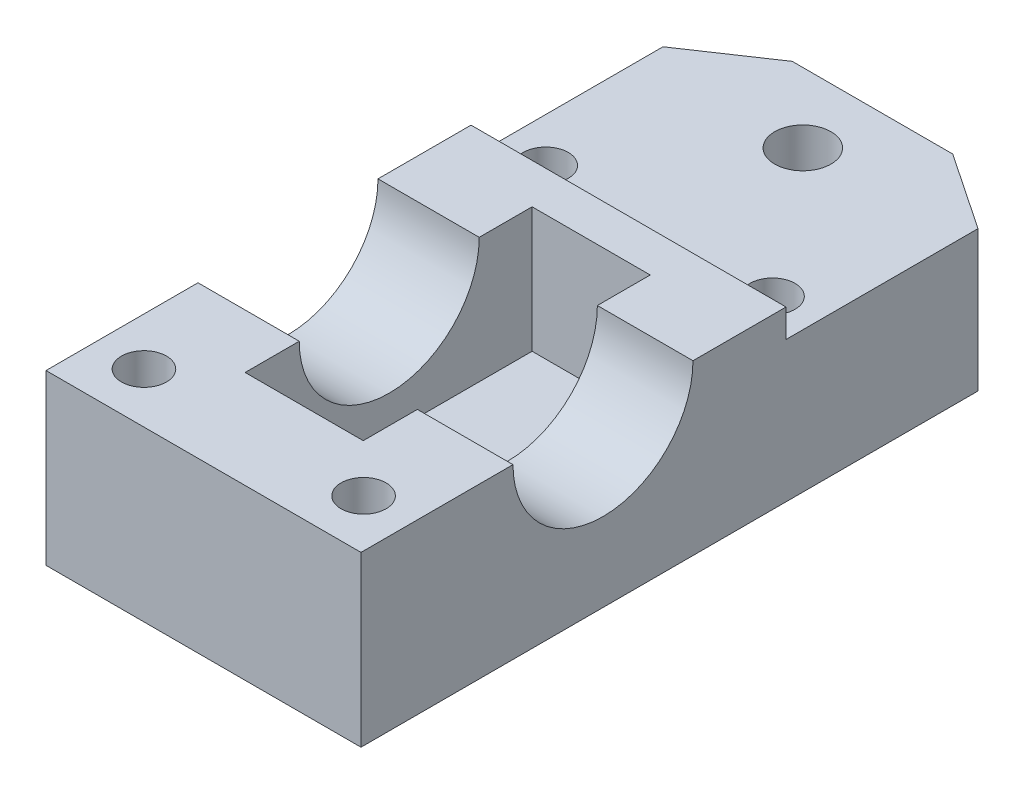
ISO-10303-21;
HEADER;
FILE_DESCRIPTION(('STEP AP214'),'2;1');
FILE_NAME('part.step','',(''),(''),'','','');
FILE_SCHEMA(('AUTOMOTIVE_DESIGN { 1 0 10303 214 1 1 1 1 }'));
ENDSEC;
DATA;
#1=APPLICATION_CONTEXT('core data for automotive mechanical design processes');
#2=APPLICATION_PROTOCOL_DEFINITION('international standard','automotive_design',2000,#1);
#3=PRODUCT_CONTEXT('',#1,'mechanical');
#4=PRODUCT('Part','Part','',(#3));
#5=PRODUCT_RELATED_PRODUCT_CATEGORY('part','',(#4));
#6=PRODUCT_DEFINITION_FORMATION('','',#4);
#7=PRODUCT_DEFINITION_CONTEXT('part definition',#1,'design');
#8=PRODUCT_DEFINITION('design','',#6,#7);
#9=PRODUCT_DEFINITION_SHAPE('','',#8);
#10=(LENGTH_UNIT() NAMED_UNIT(*) SI_UNIT(.MILLI.,.METRE.));
#11=(NAMED_UNIT(*) PLANE_ANGLE_UNIT() SI_UNIT($,.RADIAN.));
#12=(NAMED_UNIT(*) SI_UNIT($,.STERADIAN.) SOLID_ANGLE_UNIT());
#13=UNCERTAINTY_MEASURE_WITH_UNIT(LENGTH_MEASURE(1.E-05),#10,'distance_accuracy_value','');
#14=(GEOMETRIC_REPRESENTATION_CONTEXT(3) GLOBAL_UNCERTAINTY_ASSIGNED_CONTEXT((#13)) GLOBAL_UNIT_ASSIGNED_CONTEXT((#10,
#11,#12)) REPRESENTATION_CONTEXT('',''));
#15=CARTESIAN_POINT('',(0.,0.,0.));
#16=DIRECTION('',(0.,0.,1.));
#17=DIRECTION('',(1.,0.,0.));
#18=AXIS2_PLACEMENT_3D('',#15,#16,#17);
#19=CARTESIAN_POINT('',(14.,15.,27.8802988395114));
#20=DIRECTION('',(0.,1.,0.));
#21=DIRECTION('',(0.,0.,1.));
#22=AXIS2_PLACEMENT_3D('',#19,#20,#21);
#23=PLANE('',#22);
#24=CARTESIAN_POINT('',(9.76104748218694,15.,23.4115544975059));
#25=DIRECTION('',(0.,1.,0.));
#26=DIRECTION('',(0.,0.,-1.));
#27=AXIS2_PLACEMENT_3D('',#24,#25,#26);
#28=CIRCLE('',#27,2.);
#29=CARTESIAN_POINT('',(9.76104748218694,15.,21.4115544975059));
#30=VERTEX_POINT('',#29);
#31=EDGE_CURVE('E180',#30,#30,#28,.T.);
#32=ORIENTED_EDGE('',*,*,#31,.F.);
#33=EDGE_LOOP('',(#32));
#34=FACE_BOUND('',#33,.T.);
#35=CARTESIAN_POINT('',(-9.76104748218696,15.,23.4115544975059));
#36=DIRECTION('',(0.,1.,0.));
#37=DIRECTION('',(0.,0.,1.));
#38=AXIS2_PLACEMENT_3D('',#35,#36,#37);
#39=CIRCLE('',#38,2.);
#40=CARTESIAN_POINT('',(-9.76104748218696,15.,25.4115544975059));
#41=VERTEX_POINT('',#40);
#42=EDGE_CURVE('E184',#41,#41,#39,.T.);
#43=ORIENTED_EDGE('',*,*,#42,.F.);
#44=EDGE_LOOP('',(#43));
#45=FACE_BOUND('',#44,.T.);
#46=DIRECTION('',(1.,0.,0.));
#47=VECTOR('',#46,1.);
#48=CARTESIAN_POINT('',(-14.,15.,14.370296179535));
#49=LINE('',#48,#47);
#50=CARTESIAN_POINT('',(-14.,15.,14.370296179535));
#51=VERTEX_POINT('',#50);
#52=CARTESIAN_POINT('',(-5.,15.,14.370296179535));
#53=VERTEX_POINT('',#52);
#54=EDGE_CURVE('E56',#51,#53,#49,.T.);
#55=ORIENTED_EDGE('',*,*,#54,.F.);
#56=DIRECTION('',(0.,0.,1.));
#57=VECTOR('',#56,1.);
#58=CARTESIAN_POINT('',(-14.,15.,-26.9642041662331));
#59=LINE('',#58,#57);
#60=CARTESIAN_POINT('',(-14.,15.,27.8802988395114));
#61=VERTEX_POINT('',#60);
#62=EDGE_CURVE('E247',#51,#61,#59,.T.);
#63=ORIENTED_EDGE('',*,*,#62,.T.);
#64=DIRECTION('',(1.,0.,0.));
#65=VECTOR('',#64,1.);
#66=CARTESIAN_POINT('',(-14.,15.,27.8802988395114));
#67=LINE('',#66,#65);
#68=CARTESIAN_POINT('',(14.,15.,27.8802988395114));
#69=VERTEX_POINT('',#68);
#70=EDGE_CURVE('E251',#61,#69,#67,.T.);
#71=ORIENTED_EDGE('',*,*,#70,.T.);
#72=DIRECTION('',(0.,0.,-1.));
#73=VECTOR('',#72,1.);
#74=CARTESIAN_POINT('',(14.,15.,-26.9642041662331));
#75=LINE('',#74,#73);
#76=CARTESIAN_POINT('',(14.,15.,14.370296179535));
#77=VERTEX_POINT('',#76);
#78=EDGE_CURVE('E244',#69,#77,#75,.T.);
#79=ORIENTED_EDGE('',*,*,#78,.T.);
#80=CARTESIAN_POINT('',(5.5,15.,14.370296179535));
#81=VERTEX_POINT('',#80);
#82=EDGE_CURVE('E199',#81,#77,#49,.T.);
#83=ORIENTED_EDGE('',*,*,#82,.F.);
#84=DIRECTION('',(0.,0.,1.));
#85=VECTOR('',#84,1.);
#86=CARTESIAN_POINT('',(5.5,15.,-6.32837239447517));
#87=LINE('',#86,#85);
#88=CARTESIAN_POINT('',(5.5,15.,19.1819459682045));
#89=VERTEX_POINT('',#88);
#90=EDGE_CURVE('E222',#81,#89,#87,.T.);
#91=ORIENTED_EDGE('',*,*,#90,.T.);
#92=DIRECTION('',(1.,0.,0.));
#93=VECTOR('',#92,1.);
#94=CARTESIAN_POINT('',(-5.,15.,19.1819459682045));
#95=LINE('',#94,#93);
#96=CARTESIAN_POINT('',(-5.,15.,19.1819459682045));
#97=VERTEX_POINT('',#96);
#98=EDGE_CURVE('E217',#97,#89,#95,.T.);
#99=ORIENTED_EDGE('',*,*,#98,.F.);
#100=DIRECTION('',(0.,0.,1.));
#101=VECTOR('',#100,1.);
#102=CARTESIAN_POINT('',(-5.,15.,-6.32837239447517));
#103=LINE('',#102,#101);
#104=EDGE_CURVE('E208',#53,#97,#103,.T.);
#105=ORIENTED_EDGE('',*,*,#104,.F.);
#106=EDGE_LOOP('',(#55,#63,#71,#79,#83,#91,#99,#105));
#107=FACE_BOUND('',#106,.T.);
#108=ADVANCED_FACE('F32',(#34,#45,#107),#23,.T.);
#109=DIRECTION('',(1.,0.,0.));
#110=VECTOR('',#109,1.);
#111=CARTESIAN_POINT('',(14.,15.,-9.8999192844025));
#112=LINE('',#111,#110);
#113=CARTESIAN_POINT('',(-14.,15.,-9.89991928440249));
#114=VERTEX_POINT('',#113);
#115=CARTESIAN_POINT('',(14.,15.,-9.8999192844025));
#116=VERTEX_POINT('',#115);
#117=EDGE_CURVE('E159',#114,#116,#112,.T.);
#118=ORIENTED_EDGE('',*,*,#117,.F.);
#119=CARTESIAN_POINT('',(-14.,15.,-1.629703820465));
#120=VERTEX_POINT('',#119);
#121=EDGE_CURVE('E249',#114,#120,#59,.T.);
#122=ORIENTED_EDGE('',*,*,#121,.T.);
#123=DIRECTION('',(1.,0.,0.));
#124=VECTOR('',#123,1.);
#125=CARTESIAN_POINT('',(-14.,15.,-1.629703820465));
#126=LINE('',#125,#124);
#127=CARTESIAN_POINT('',(-5.,15.,-1.629703820465));
#128=VERTEX_POINT('',#127);
#129=EDGE_CURVE('E200',#128,#120,#126,.F.);
#130=ORIENTED_EDGE('',*,*,#129,.F.);
#131=CARTESIAN_POINT('',(-5.,15.,-6.32837239447517));
#132=VERTEX_POINT('',#131);
#133=EDGE_CURVE('E204',#132,#128,#103,.T.);
#134=ORIENTED_EDGE('',*,*,#133,.F.);
#135=DIRECTION('',(1.,0.,0.));
#136=VECTOR('',#135,1.);
#137=CARTESIAN_POINT('',(-5.,15.,-6.32837239447517));
#138=LINE('',#137,#136);
#139=CARTESIAN_POINT('',(5.5,15.,-6.32837239447517));
#140=VERTEX_POINT('',#139);
#141=EDGE_CURVE('E231',#132,#140,#138,.T.);
#142=ORIENTED_EDGE('',*,*,#141,.T.);
#143=CARTESIAN_POINT('',(5.5,15.,-1.629703820465));
#144=VERTEX_POINT('',#143);
#145=EDGE_CURVE('E218',#140,#144,#87,.T.);
#146=ORIENTED_EDGE('',*,*,#145,.T.);
#147=CARTESIAN_POINT('',(14.,15.,-1.629703820465));
#148=VERTEX_POINT('',#147);
#149=EDGE_CURVE('E196',#148,#144,#126,.F.);
#150=ORIENTED_EDGE('',*,*,#149,.F.);
#151=EDGE_CURVE('E248',#148,#116,#75,.T.);
#152=ORIENTED_EDGE('',*,*,#151,.T.);
#153=EDGE_LOOP('',(#118,#122,#130,#134,#142,#146,#150,#152));
#154=FACE_BOUND('',#153,.T.);
#155=ADVANCED_FACE('F317',(#154),#23,.T.);
#156=CARTESIAN_POINT('',(14.,0.,27.8802988395114));
#157=DIRECTION('',(0.,1.,0.));
#158=DIRECTION('',(0.,0.,1.));
#159=AXIS2_PLACEMENT_3D('',#156,#157,#158);
#160=PLANE('',#159);
#161=CARTESIAN_POINT('',(10.0800389171649,0.,-12.6210657860775));
#162=DIRECTION('',(0.,1.,0.));
#163=DIRECTION('',(0.,0.,-1.));
#164=AXIS2_PLACEMENT_3D('',#161,#162,#163);
#165=CIRCLE('',#164,2.);
#166=CARTESIAN_POINT('',(10.0800389171649,0.,-10.6210657860775));
#167=VERTEX_POINT('',#166);
#168=EDGE_CURVE('E522',#167,#167,#165,.T.);
#169=ORIENTED_EDGE('',*,*,#168,.T.);
#170=EDGE_LOOP('',(#169));
#171=FACE_BOUND('',#170,.T.);
#172=CARTESIAN_POINT('',(-10.0800389171649,0.,-12.6210657860775));
#173=DIRECTION('',(0.,1.,0.));
#174=DIRECTION('',(0.,0.,1.));
#175=AXIS2_PLACEMENT_3D('',#172,#173,#174);
#176=CIRCLE('',#175,2.);
#177=CARTESIAN_POINT('',(-10.0800389171649,0.,-10.6210657860775));
#178=VERTEX_POINT('',#177);
#179=EDGE_CURVE('E173',#178,#178,#176,.T.);
#180=ORIENTED_EDGE('',*,*,#179,.T.);
#181=EDGE_LOOP('',(#180));
#182=FACE_BOUND('',#181,.T.);
#183=CARTESIAN_POINT('',(9.76104748218694,0.,23.4115544975059));
#184=DIRECTION('',(0.,1.,0.));
#185=DIRECTION('',(0.,0.,-1.));
#186=AXIS2_PLACEMENT_3D('',#183,#184,#185);
#187=CIRCLE('',#186,2.);
#188=CARTESIAN_POINT('',(9.76104748218694,0.,21.4115544975059));
#189=VERTEX_POINT('',#188);
#190=EDGE_CURVE('E181',#189,#189,#187,.T.);
#191=ORIENTED_EDGE('',*,*,#190,.T.);
#192=EDGE_LOOP('',(#191));
#193=FACE_BOUND('',#192,.T.);
#194=CARTESIAN_POINT('',(-9.76104748218696,0.,23.4115544975059));
#195=DIRECTION('',(0.,1.,0.));
#196=DIRECTION('',(0.,0.,1.));
#197=AXIS2_PLACEMENT_3D('',#194,#195,#196);
#198=CIRCLE('',#197,2.);
#199=CARTESIAN_POINT('',(-9.76104748218696,0.,25.4115544975059));
#200=VERTEX_POINT('',#199);
#201=EDGE_CURVE('E187',#200,#200,#198,.T.);
#202=ORIENTED_EDGE('',*,*,#201,.T.);
#203=EDGE_LOOP('',(#202));
#204=FACE_BOUND('',#203,.T.);
#205=DIRECTION('',(0.,0.,-1.));
#206=VECTOR('',#205,1.);
#207=CARTESIAN_POINT('',(14.,0.,-26.9642041662331));
#208=LINE('',#207,#206);
#209=CARTESIAN_POINT('',(14.,0.,27.8802988395114));
#210=VERTEX_POINT('',#209);
#211=CARTESIAN_POINT('',(14.,0.,-26.9642041662331));
#212=VERTEX_POINT('',#211);
#213=EDGE_CURVE('E243',#210,#212,#208,.T.);
#214=ORIENTED_EDGE('',*,*,#213,.F.);
#215=DIRECTION('',(1.,0.,0.));
#216=VECTOR('',#215,1.);
#217=CARTESIAN_POINT('',(-14.,0.,27.8802988395114));
#218=LINE('',#217,#216);
#219=CARTESIAN_POINT('',(-14.,0.,27.8802988395114));
#220=VERTEX_POINT('',#219);
#221=EDGE_CURVE('E266',#220,#210,#218,.T.);
#222=ORIENTED_EDGE('',*,*,#221,.F.);
#223=DIRECTION('',(0.,0.,1.));
#224=VECTOR('',#223,1.);
#225=CARTESIAN_POINT('',(-14.,0.,-26.9642041662331));
#226=LINE('',#225,#224);
#227=CARTESIAN_POINT('',(-14.,0.,-26.9642041662331));
#228=VERTEX_POINT('',#227);
#229=EDGE_CURVE('E264',#228,#220,#226,.T.);
#230=ORIENTED_EDGE('',*,*,#229,.F.);
#231=DIRECTION('',(-0.82965477811203,0.,0.558276767522953));
#232=VECTOR('',#231,1.);
#233=CARTESIAN_POINT('',(-14.,0.,-26.9642041662331));
#234=LINE('',#233,#232);
#235=CARTESIAN_POINT('',(-7.13172713902183,0.,-31.5858820887277));
#236=VERTEX_POINT('',#235);
#237=EDGE_CURVE('E261',#236,#228,#234,.T.);
#238=ORIENTED_EDGE('',*,*,#237,.F.);
#239=DIRECTION('',(-1.,0.,0.));
#240=VECTOR('',#239,1.);
#241=CARTESIAN_POINT('',(-7.13172713902183,0.,-31.5858820887277));
#242=LINE('',#241,#240);
#243=CARTESIAN_POINT('',(7.13172713902183,0.,-31.5858820887277));
#244=VERTEX_POINT('',#243);
#245=EDGE_CURVE('E258',#244,#236,#242,.T.);
#246=ORIENTED_EDGE('',*,*,#245,.F.);
#247=DIRECTION('',(-0.82965477811203,0.,-0.558276767522953));
#248=VECTOR('',#247,1.);
#249=CARTESIAN_POINT('',(14.,0.,-26.9642041662331));
#250=LINE('',#249,#248);
#251=EDGE_CURVE('E255',#212,#244,#250,.T.);
#252=ORIENTED_EDGE('',*,*,#251,.F.);
#253=EDGE_LOOP('',(#214,#222,#230,#238,#246,#252));
#254=FACE_BOUND('',#253,.T.);
#255=CARTESIAN_POINT('',(0.,0.,-25.393583101561));
#256=DIRECTION('',(0.,1.,0.));
#257=DIRECTION('',(0.,0.,1.));
#258=AXIS2_PLACEMENT_3D('',#255,#256,#257);
#259=CIRCLE('',#258,2.5);
#260=CARTESIAN_POINT('',(0.,0.,-22.893583101561));
#261=VERTEX_POINT('',#260);
#262=EDGE_CURVE('E234',#261,#261,#259,.T.);
#263=ORIENTED_EDGE('',*,*,#262,.T.);
#264=EDGE_LOOP('',(#263));
#265=FACE_BOUND('',#264,.T.);
#266=ADVANCED_FACE('F286',(#171,#182,#193,#204,#254,#265),#160,.F.);
#267=CARTESIAN_POINT('',(14.,15.,-26.9642041662331));
#268=DIRECTION('',(-1.,0.,0.));
#269=DIRECTION('',(0.,0.,1.));
#270=AXIS2_PLACEMENT_3D('',#267,#268,#269);
#271=PLANE('',#270);
#272=DIRECTION('',(0.,0.,1.));
#273=VECTOR('',#272,1.);
#274=CARTESIAN_POINT('',(14.,12.5,-31.5858820887277));
#275=LINE('',#274,#273);
#276=CARTESIAN_POINT('',(14.,12.5,-26.9642041662331));
#277=VERTEX_POINT('',#276);
#278=CARTESIAN_POINT('',(14.,12.5,-9.8999192844025));
#279=VERTEX_POINT('',#278);
#280=EDGE_CURVE('E148',#277,#279,#275,.T.);
#281=ORIENTED_EDGE('',*,*,#280,.T.);
#282=DIRECTION('',(0.,1.,0.));
#283=VECTOR('',#282,1.);
#284=CARTESIAN_POINT('',(14.,18.9663543482973,-9.8999192844025));
#285=LINE('',#284,#283);
#286=EDGE_CURVE('E156',#279,#116,#285,.T.);
#287=ORIENTED_EDGE('',*,*,#286,.T.);
#288=ORIENTED_EDGE('',*,*,#151,.F.);
#289=CARTESIAN_POINT('',(14.,15.,6.370296179535));
#290=DIRECTION('',(1.,0.,0.));
#291=DIRECTION('',(0.,0.,-1.));
#292=AXIS2_PLACEMENT_3D('',#289,#290,#291);
#293=CIRCLE('',#292,8.);
#294=EDGE_CURVE('E190',#77,#148,#293,.T.);
#295=ORIENTED_EDGE('',*,*,#294,.F.);
#296=ORIENTED_EDGE('',*,*,#78,.F.);
#297=DIRECTION('',(0.,-1.,0.));
#298=VECTOR('',#297,1.);
#299=CARTESIAN_POINT('',(14.,15.,27.8802988395114));
#300=LINE('',#299,#298);
#301=EDGE_CURVE('E253',#69,#210,#300,.T.);
#302=ORIENTED_EDGE('',*,*,#301,.T.);
#303=ORIENTED_EDGE('',*,*,#213,.T.);
#304=DIRECTION('',(0.,-1.,0.));
#305=VECTOR('',#304,1.);
#306=CARTESIAN_POINT('',(14.,15.,-26.9642041662331));
#307=LINE('',#306,#305);
#308=EDGE_CURVE('E41',#277,#212,#307,.T.);
#309=ORIENTED_EDGE('',*,*,#308,.F.);
#310=EDGE_LOOP('',(#281,#287,#288,#295,#296,#302,#303,#309));
#311=FACE_BOUND('',#310,.T.);
#312=ADVANCED_FACE('F34',(#311),#271,.F.);
#313=CARTESIAN_POINT('',(14.,15.,-26.9642041662331));
#314=DIRECTION('',(-0.558276767522953,0.,0.82965477811203));
#315=DIRECTION('',(0.829654778112031,0.,0.558276767522953));
#316=AXIS2_PLACEMENT_3D('',#313,#314,#315);
#317=PLANE('',#316);
#318=DIRECTION('',(0.,-1.,0.));
#319=VECTOR('',#318,1.);
#320=CARTESIAN_POINT('',(7.13172713902183,15.,-31.5858820887277));
#321=LINE('',#320,#319);
#322=CARTESIAN_POINT('',(7.13172713902183,12.5,-31.5858820887277));
#323=VERTEX_POINT('',#322);
#324=EDGE_CURVE('E277',#323,#244,#321,.T.);
#325=ORIENTED_EDGE('',*,*,#324,.F.);
#326=DIRECTION('',(0.829654778112031,0.,0.558276767522953));
#327=VECTOR('',#326,1.);
#328=CARTESIAN_POINT('',(14.,12.5,-26.9642041662331));
#329=LINE('',#328,#327);
#330=EDGE_CURVE('E177',#323,#277,#329,.T.);
#331=ORIENTED_EDGE('',*,*,#330,.T.);
#332=ORIENTED_EDGE('',*,*,#308,.T.);
#333=ORIENTED_EDGE('',*,*,#251,.T.);
#334=EDGE_LOOP('',(#325,#331,#332,#333));
#335=FACE_BOUND('',#334,.T.);
#336=ADVANCED_FACE('F282',(#335),#317,.F.);
#337=CARTESIAN_POINT('',(-7.13172713902183,15.,-31.5858820887277));
#338=DIRECTION('',(0.,0.,1.));
#339=DIRECTION('',(1.,0.,0.));
#340=AXIS2_PLACEMENT_3D('',#337,#338,#339);
#341=PLANE('',#340);
#342=DIRECTION('',(0.,-1.,0.));
#343=VECTOR('',#342,1.);
#344=CARTESIAN_POINT('',(-7.13172713902183,15.,-31.5858820887277));
#345=LINE('',#344,#343);
#346=CARTESIAN_POINT('',(-7.13172713902182,12.5,-31.5858820887277));
#347=VERTEX_POINT('',#346);
#348=EDGE_CURVE('E275',#347,#236,#345,.T.);
#349=ORIENTED_EDGE('',*,*,#348,.F.);
#350=DIRECTION('',(-1.,0.,0.));
#351=VECTOR('',#350,1.);
#352=CARTESIAN_POINT('',(14.,12.5,-31.5858820887277));
#353=LINE('',#352,#351);
#354=EDGE_CURVE('E153',#323,#347,#353,.T.);
#355=ORIENTED_EDGE('',*,*,#354,.F.);
#356=ORIENTED_EDGE('',*,*,#324,.T.);
#357=ORIENTED_EDGE('',*,*,#245,.T.);
#358=EDGE_LOOP('',(#349,#355,#356,#357));
#359=FACE_BOUND('',#358,.T.);
#360=ADVANCED_FACE('F308',(#359),#341,.F.);
#361=CARTESIAN_POINT('',(-14.,15.,-26.9642041662331));
#362=DIRECTION('',(0.558276767522953,0.,0.82965477811203));
#363=DIRECTION('',(0.829654778112031,0.,-0.558276767522953));
#364=AXIS2_PLACEMENT_3D('',#361,#362,#363);
#365=PLANE('',#364);
#366=DIRECTION('',(0.,-1.,0.));
#367=VECTOR('',#366,1.);
#368=CARTESIAN_POINT('',(-14.,15.,-26.9642041662331));
#369=LINE('',#368,#367);
#370=CARTESIAN_POINT('',(-14.,12.5,-26.9642041662331));
#371=VERTEX_POINT('',#370);
#372=EDGE_CURVE('E273',#371,#228,#369,.T.);
#373=ORIENTED_EDGE('',*,*,#372,.F.);
#374=DIRECTION('',(0.829654778112031,0.,-0.558276767522953));
#375=VECTOR('',#374,1.);
#376=CARTESIAN_POINT('',(-14.,12.5,-26.9642041662331));
#377=LINE('',#376,#375);
#378=EDGE_CURVE('E48',#371,#347,#377,.T.);
#379=ORIENTED_EDGE('',*,*,#378,.T.);
#380=ORIENTED_EDGE('',*,*,#348,.T.);
#381=ORIENTED_EDGE('',*,*,#237,.T.);
#382=EDGE_LOOP('',(#373,#379,#380,#381));
#383=FACE_BOUND('',#382,.T.);
#384=ADVANCED_FACE('F304',(#383),#365,.F.);
#385=CARTESIAN_POINT('',(-14.,15.,-26.9642041662331));
#386=DIRECTION('',(1.,0.,0.));
#387=DIRECTION('',(0.,0.,-1.));
#388=AXIS2_PLACEMENT_3D('',#385,#386,#387);
#389=PLANE('',#388);
#390=ORIENTED_EDGE('',*,*,#121,.F.);
#391=DIRECTION('',(0.,1.,0.));
#392=VECTOR('',#391,1.);
#393=CARTESIAN_POINT('',(-14.,18.9663543482973,-9.89991928440249));
#394=LINE('',#393,#392);
#395=CARTESIAN_POINT('',(-14.,12.5,-9.89991928440249));
#396=VERTEX_POINT('',#395);
#397=EDGE_CURVE('E166',#396,#114,#394,.T.);
#398=ORIENTED_EDGE('',*,*,#397,.F.);
#399=DIRECTION('',(0.,0.,1.));
#400=VECTOR('',#399,1.);
#401=CARTESIAN_POINT('',(-14.,12.5,-31.5858820887277));
#402=LINE('',#401,#400);
#403=EDGE_CURVE('E150',#371,#396,#402,.T.);
#404=ORIENTED_EDGE('',*,*,#403,.F.);
#405=ORIENTED_EDGE('',*,*,#372,.T.);
#406=ORIENTED_EDGE('',*,*,#229,.T.);
#407=DIRECTION('',(0.,-1.,0.));
#408=VECTOR('',#407,1.);
#409=CARTESIAN_POINT('',(-14.,15.,27.8802988395114));
#410=LINE('',#409,#408);
#411=EDGE_CURVE('E270',#61,#220,#410,.T.);
#412=ORIENTED_EDGE('',*,*,#411,.F.);
#413=ORIENTED_EDGE('',*,*,#62,.F.);
#414=CARTESIAN_POINT('',(-14.,15.,6.37029617953501));
#415=DIRECTION('',(1.,0.,0.));
#416=DIRECTION('',(0.,0.,-1.));
#417=AXIS2_PLACEMENT_3D('',#414,#415,#416);
#418=CIRCLE('',#417,8.);
#419=EDGE_CURVE('E193',#51,#120,#418,.T.);
#420=ORIENTED_EDGE('',*,*,#419,.T.);
#421=EDGE_LOOP('',(#390,#398,#404,#405,#406,#412,#413,#420));
#422=FACE_BOUND('',#421,.T.);
#423=ADVANCED_FACE('F300',(#422),#389,.F.);
#424=CARTESIAN_POINT('',(-14.,15.,27.8802988395114));
#425=DIRECTION('',(0.,0.,-1.));
#426=DIRECTION('',(-1.,0.,0.));
#427=AXIS2_PLACEMENT_3D('',#424,#425,#426);
#428=PLANE('',#427);
#429=ORIENTED_EDGE('',*,*,#221,.T.);
#430=ORIENTED_EDGE('',*,*,#301,.F.);
#431=ORIENTED_EDGE('',*,*,#70,.F.);
#432=ORIENTED_EDGE('',*,*,#411,.T.);
#433=EDGE_LOOP('',(#429,#430,#431,#432));
#434=FACE_BOUND('',#433,.T.);
#435=ADVANCED_FACE('F295',(#434),#428,.F.);
#436=CARTESIAN_POINT('',(0.,15.,-25.393583101561));
#437=DIRECTION('',(0.,-1.,0.));
#438=DIRECTION('',(0.,0.,-1.));
#439=AXIS2_PLACEMENT_3D('',#436,#437,#438);
#440=CYLINDRICAL_SURFACE('',#439,2.5);
#441=CARTESIAN_POINT('',(0.,12.5,-25.393583101561));
#442=DIRECTION('',(0.,-1.,0.));
#443=DIRECTION('',(0.,0.,-1.));
#444=AXIS2_PLACEMENT_3D('',#441,#442,#443);
#445=CIRCLE('',#444,2.5);
#446=CARTESIAN_POINT('',(0.,12.5,-27.893583101561));
#447=VERTEX_POINT('',#446);
#448=EDGE_CURVE('E36',#447,#447,#445,.T.);
#449=ORIENTED_EDGE('',*,*,#448,.F.);
#450=EDGE_LOOP('',(#449));
#451=FACE_BOUND('',#450,.T.);
#452=ORIENTED_EDGE('',*,*,#262,.F.);
#453=EDGE_LOOP('',(#452));
#454=FACE_BOUND('',#453,.T.);
#455=ADVANCED_FACE('F328',(#451,#454),#440,.F.);
#456=CARTESIAN_POINT('',(-5.,3.87685184192654,-6.32837239447517));
#457=DIRECTION('',(0.,0.,-1.));
#458=DIRECTION('',(0.,1.,0.));
#459=AXIS2_PLACEMENT_3D('',#456,#457,#458);
#460=PLANE('',#459);
#461=DIRECTION('',(0.,1.,0.));
#462=VECTOR('',#461,1.);
#463=CARTESIAN_POINT('',(5.5,3.87685184192654,-6.32837239447517));
#464=LINE('',#463,#462);
#465=CARTESIAN_POINT('',(5.5,3.87685184192654,-6.32837239447517));
#466=VERTEX_POINT('',#465);
#467=EDGE_CURVE('E228',#466,#140,#464,.T.);
#468=ORIENTED_EDGE('',*,*,#467,.T.);
#469=ORIENTED_EDGE('',*,*,#141,.F.);
#470=DIRECTION('',(0.,1.,0.));
#471=VECTOR('',#470,1.);
#472=CARTESIAN_POINT('',(-5.,3.87685184192654,-6.32837239447517));
#473=LINE('',#472,#471);
#474=CARTESIAN_POINT('',(-5.,3.87685184192654,-6.32837239447517));
#475=VERTEX_POINT('',#474);
#476=EDGE_CURVE('E214',#475,#132,#473,.T.);
#477=ORIENTED_EDGE('',*,*,#476,.F.);
#478=DIRECTION('',(1.,0.,0.));
#479=VECTOR('',#478,1.);
#480=CARTESIAN_POINT('',(-5.,3.87685184192654,-6.32837239447517));
#481=LINE('',#480,#479);
#482=EDGE_CURVE('E235',#475,#466,#481,.T.);
#483=ORIENTED_EDGE('',*,*,#482,.T.);
#484=EDGE_LOOP('',(#468,#469,#477,#483));
#485=FACE_BOUND('',#484,.T.);
#486=ADVANCED_FACE('F351',(#485),#460,.F.);
#487=CARTESIAN_POINT('',(-5.,3.87685184192654,19.1819459682045));
#488=DIRECTION('',(0.,-1.,0.));
#489=DIRECTION('',(0.,0.,-1.));
#490=AXIS2_PLACEMENT_3D('',#487,#488,#489);
#491=PLANE('',#490);
#492=DIRECTION('',(0.,0.,-1.));
#493=VECTOR('',#492,1.);
#494=CARTESIAN_POINT('',(5.5,3.87685184192654,19.1819459682045));
#495=LINE('',#494,#493);
#496=CARTESIAN_POINT('',(5.5,3.87685184192654,19.1819459682045));
#497=VERTEX_POINT('',#496);
#498=EDGE_CURVE('E225',#497,#466,#495,.T.);
#499=ORIENTED_EDGE('',*,*,#498,.T.);
#500=ORIENTED_EDGE('',*,*,#482,.F.);
#501=DIRECTION('',(0.,0.,-1.));
#502=VECTOR('',#501,1.);
#503=CARTESIAN_POINT('',(-5.,3.87685184192654,19.1819459682045));
#504=LINE('',#503,#502);
#505=CARTESIAN_POINT('',(-5.,3.87685184192654,19.1819459682045));
#506=VERTEX_POINT('',#505);
#507=EDGE_CURVE('E211',#506,#475,#504,.T.);
#508=ORIENTED_EDGE('',*,*,#507,.F.);
#509=DIRECTION('',(1.,0.,0.));
#510=VECTOR('',#509,1.);
#511=CARTESIAN_POINT('',(-5.,3.87685184192654,19.1819459682045));
#512=LINE('',#511,#510);
#513=EDGE_CURVE('E237',#506,#497,#512,.T.);
#514=ORIENTED_EDGE('',*,*,#513,.T.);
#515=EDGE_LOOP('',(#499,#500,#508,#514));
#516=FACE_BOUND('',#515,.T.);
#517=ADVANCED_FACE('F358',(#516),#491,.F.);
#518=CARTESIAN_POINT('',(-5.,15.,19.1819459682045));
#519=DIRECTION('',(0.,0.,1.));
#520=DIRECTION('',(0.,-1.,0.));
#521=AXIS2_PLACEMENT_3D('',#518,#519,#520);
#522=PLANE('',#521);
#523=DIRECTION('',(0.,-1.,0.));
#524=VECTOR('',#523,1.);
#525=CARTESIAN_POINT('',(5.5,15.,19.1819459682045));
#526=LINE('',#525,#524);
#527=EDGE_CURVE('E221',#89,#497,#526,.T.);
#528=ORIENTED_EDGE('',*,*,#527,.T.);
#529=ORIENTED_EDGE('',*,*,#513,.F.);
#530=DIRECTION('',(0.,-1.,0.));
#531=VECTOR('',#530,1.);
#532=CARTESIAN_POINT('',(-5.,15.,19.1819459682045));
#533=LINE('',#532,#531);
#534=EDGE_CURVE('E207',#97,#506,#533,.T.);
#535=ORIENTED_EDGE('',*,*,#534,.F.);
#536=ORIENTED_EDGE('',*,*,#98,.T.);
#537=EDGE_LOOP('',(#528,#529,#535,#536));
#538=FACE_BOUND('',#537,.T.);
#539=ADVANCED_FACE('F366',(#538),#522,.F.);
#540=CARTESIAN_POINT('',(-5.,15.,19.1819459682045));
#541=DIRECTION('',(1.,0.,0.));
#542=DIRECTION('',(0.,0.,-1.));
#543=AXIS2_PLACEMENT_3D('',#540,#541,#542);
#544=PLANE('',#543);
#545=CARTESIAN_POINT('',(-5.,15.,6.370296179535));
#546=DIRECTION('',(1.,0.,0.));
#547=DIRECTION('',(0.,0.,-1.));
#548=AXIS2_PLACEMENT_3D('',#545,#546,#547);
#549=CIRCLE('',#548,8.);
#550=EDGE_CURVE('E202',#53,#128,#549,.T.);
#551=ORIENTED_EDGE('',*,*,#550,.F.);
#552=ORIENTED_EDGE('',*,*,#104,.T.);
#553=ORIENTED_EDGE('',*,*,#534,.T.);
#554=ORIENTED_EDGE('',*,*,#507,.T.);
#555=ORIENTED_EDGE('',*,*,#476,.T.);
#556=ORIENTED_EDGE('',*,*,#133,.T.);
#557=EDGE_LOOP('',(#551,#552,#553,#554,#555,#556));
#558=FACE_BOUND('',#557,.T.);
#559=ADVANCED_FACE('F374',(#558),#544,.T.);
#560=CARTESIAN_POINT('',(5.5,15.,19.1819459682045));
#561=DIRECTION('',(1.,0.,0.));
#562=DIRECTION('',(0.,0.,-1.));
#563=AXIS2_PLACEMENT_3D('',#560,#561,#562);
#564=PLANE('',#563);
#565=ORIENTED_EDGE('',*,*,#90,.F.);
#566=CARTESIAN_POINT('',(5.5,15.,6.370296179535));
#567=DIRECTION('',(1.,0.,0.));
#568=DIRECTION('',(0.,0.,-1.));
#569=AXIS2_PLACEMENT_3D('',#566,#567,#568);
#570=CIRCLE('',#569,8.);
#571=EDGE_CURVE('E11',#81,#144,#570,.T.);
#572=ORIENTED_EDGE('',*,*,#571,.T.);
#573=ORIENTED_EDGE('',*,*,#145,.F.);
#574=ORIENTED_EDGE('',*,*,#467,.F.);
#575=ORIENTED_EDGE('',*,*,#498,.F.);
#576=ORIENTED_EDGE('',*,*,#527,.F.);
#577=EDGE_LOOP('',(#565,#572,#573,#574,#575,#576));
#578=FACE_BOUND('',#577,.T.);
#579=ADVANCED_FACE('F381',(#578),#564,.F.);
#580=CARTESIAN_POINT('',(-14.,15.,6.37029617953501));
#581=DIRECTION('',(1.,0.,0.));
#582=DIRECTION('',(0.,0.,-1.));
#583=AXIS2_PLACEMENT_3D('',#580,#581,#582);
#584=CYLINDRICAL_SURFACE('',#583,8.);
#585=ORIENTED_EDGE('',*,*,#82,.T.);
#586=ORIENTED_EDGE('',*,*,#294,.T.);
#587=ORIENTED_EDGE('',*,*,#149,.T.);
#588=ORIENTED_EDGE('',*,*,#571,.F.);
#589=EDGE_LOOP('',(#585,#586,#587,#588));
#590=FACE_BOUND('',#589,.T.);
#591=ADVANCED_FACE('F389',(#590),#584,.F.);
#592=ORIENTED_EDGE('',*,*,#54,.T.);
#593=ORIENTED_EDGE('',*,*,#550,.T.);
#594=ORIENTED_EDGE('',*,*,#129,.T.);
#595=ORIENTED_EDGE('',*,*,#419,.F.);
#596=EDGE_LOOP('',(#592,#593,#594,#595));
#597=FACE_BOUND('',#596,.T.);
#598=ADVANCED_FACE('F397',(#597),#584,.F.);
#599=CARTESIAN_POINT('',(-9.76104748218696,0.,23.4115544975059));
#600=DIRECTION('',(0.,1.,0.));
#601=DIRECTION('',(0.,0.,1.));
#602=AXIS2_PLACEMENT_3D('',#599,#600,#601);
#603=CYLINDRICAL_SURFACE('',#602,2.);
#604=ORIENTED_EDGE('',*,*,#201,.F.);
#605=EDGE_LOOP('',(#604));
#606=FACE_BOUND('',#605,.T.);
#607=ORIENTED_EDGE('',*,*,#42,.T.);
#608=EDGE_LOOP('',(#607));
#609=FACE_BOUND('',#608,.T.);
#610=ADVANCED_FACE('F405',(#606,#609),#603,.F.);
#611=CARTESIAN_POINT('',(9.76104748218694,0.,23.4115544975059));
#612=DIRECTION('',(0.,1.,0.));
#613=DIRECTION('',(0.,0.,1.));
#614=AXIS2_PLACEMENT_3D('',#611,#612,#613);
#615=CYLINDRICAL_SURFACE('',#614,2.);
#616=ORIENTED_EDGE('',*,*,#190,.F.);
#617=EDGE_LOOP('',(#616));
#618=FACE_BOUND('',#617,.T.);
#619=ORIENTED_EDGE('',*,*,#31,.T.);
#620=EDGE_LOOP('',(#619));
#621=FACE_BOUND('',#620,.T.);
#622=ADVANCED_FACE('F411',(#618,#621),#615,.F.);
#623=CARTESIAN_POINT('',(14.,12.5,-31.5858820887277));
#624=DIRECTION('',(0.,-1.,0.));
#625=DIRECTION('',(0.,0.,-1.));
#626=AXIS2_PLACEMENT_3D('',#623,#624,#625);
#627=PLANE('',#626);
#628=CARTESIAN_POINT('',(10.0800389171649,12.5,-12.6210657860775));
#629=DIRECTION('',(0.,1.,0.));
#630=DIRECTION('',(0.,0.,-1.));
#631=AXIS2_PLACEMENT_3D('',#628,#629,#630);
#632=CIRCLE('',#631,2.);
#633=CARTESIAN_POINT('',(10.0800389171649,12.5,-10.6210657860775));
#634=VERTEX_POINT('',#633);
#635=EDGE_CURVE('E525',#634,#634,#632,.T.);
#636=ORIENTED_EDGE('',*,*,#635,.F.);
#637=EDGE_LOOP('',(#636));
#638=FACE_BOUND('',#637,.T.);
#639=CARTESIAN_POINT('',(-10.0800389171649,12.5,-12.6210657860775));
#640=DIRECTION('',(0.,1.,0.));
#641=DIRECTION('',(0.,0.,1.));
#642=AXIS2_PLACEMENT_3D('',#639,#640,#641);
#643=CIRCLE('',#642,2.);
#644=CARTESIAN_POINT('',(-10.0800389171649,12.5,-10.6210657860775));
#645=VERTEX_POINT('',#644);
#646=EDGE_CURVE('E170',#645,#645,#643,.T.);
#647=ORIENTED_EDGE('',*,*,#646,.F.);
#648=EDGE_LOOP('',(#647));
#649=FACE_BOUND('',#648,.T.);
#650=ORIENTED_EDGE('',*,*,#448,.T.);
#651=EDGE_LOOP('',(#650));
#652=FACE_BOUND('',#651,.T.);
#653=ORIENTED_EDGE('',*,*,#354,.T.);
#654=ORIENTED_EDGE('',*,*,#378,.F.);
#655=ORIENTED_EDGE('',*,*,#403,.T.);
#656=DIRECTION('',(-1.,0.,0.));
#657=VECTOR('',#656,1.);
#658=CARTESIAN_POINT('',(14.,12.5,-9.8999192844025));
#659=LINE('',#658,#657);
#660=EDGE_CURVE('E144',#279,#396,#659,.T.);
#661=ORIENTED_EDGE('',*,*,#660,.F.);
#662=ORIENTED_EDGE('',*,*,#280,.F.);
#663=ORIENTED_EDGE('',*,*,#330,.F.);
#664=EDGE_LOOP('',(#653,#654,#655,#661,#662,#663));
#665=FACE_BOUND('',#664,.T.);
#666=ADVANCED_FACE('F146',(#638,#649,#652,#665),#627,.F.);
#667=CARTESIAN_POINT('',(14.,18.9663543482973,-9.8999192844025));
#668=DIRECTION('',(0.,0.,1.));
#669=DIRECTION('',(1.,0.,0.));
#670=AXIS2_PLACEMENT_3D('',#667,#668,#669);
#671=PLANE('',#670);
#672=ORIENTED_EDGE('',*,*,#117,.T.);
#673=ORIENTED_EDGE('',*,*,#286,.F.);
#674=ORIENTED_EDGE('',*,*,#660,.T.);
#675=ORIENTED_EDGE('',*,*,#397,.T.);
#676=EDGE_LOOP('',(#672,#673,#674,#675));
#677=FACE_BOUND('',#676,.T.);
#678=ADVANCED_FACE('F157',(#677),#671,.F.);
#679=CARTESIAN_POINT('',(-10.0800389171649,0.,-12.6210657860775));
#680=DIRECTION('',(0.,1.,0.));
#681=DIRECTION('',(0.,0.,1.));
#682=AXIS2_PLACEMENT_3D('',#679,#680,#681);
#683=CYLINDRICAL_SURFACE('',#682,2.);
#684=CARTESIAN_POINT('',(-10.0800389171649,0.,-10.6210657860775));
#685=CARTESIAN_POINT('',(-10.0800389171649,0.130208333333333,-10.6210657860775));
#686=CARTESIAN_POINT('',(-10.0800389171649,0.260416666666667,-10.6210657860775));
#687=CARTESIAN_POINT('',(-10.0800389171649,0.520833333333333,-10.6210657860775));
#688=CARTESIAN_POINT('',(-10.0800389171649,0.651041666666667,-10.6210657860775));
#689=CARTESIAN_POINT('',(-10.0800389171649,0.911458333333333,-10.6210657860775));
#690=CARTESIAN_POINT('',(-10.0800389171649,1.04166666666667,-10.6210657860775));
#691=CARTESIAN_POINT('',(-10.0800389171649,1.30208333333333,-10.6210657860775));
#692=CARTESIAN_POINT('',(-10.0800389171649,1.43229166666667,-10.6210657860775));
#693=CARTESIAN_POINT('',(-10.0800389171649,1.69270833333333,-10.6210657860775));
#694=CARTESIAN_POINT('',(-10.0800389171649,1.82291666666667,-10.6210657860775));
#695=CARTESIAN_POINT('',(-10.0800389171649,2.08333333333333,-10.6210657860775));
#696=CARTESIAN_POINT('',(-10.0800389171649,2.21354166666667,-10.6210657860775));
#697=CARTESIAN_POINT('',(-10.0800389171649,2.47395833333333,-10.6210657860775));
#698=CARTESIAN_POINT('',(-10.0800389171649,2.60416666666667,-10.6210657860775));
#699=CARTESIAN_POINT('',(-10.0800389171649,2.86458333333333,-10.6210657860775));
#700=CARTESIAN_POINT('',(-10.0800389171649,2.99479166666667,-10.6210657860775));
#701=CARTESIAN_POINT('',(-10.0800389171649,3.25520833333333,-10.6210657860775));
#702=CARTESIAN_POINT('',(-10.0800389171649,3.38541666666667,-10.6210657860775));
#703=CARTESIAN_POINT('',(-10.0800389171649,3.64583333333333,-10.6210657860775));
#704=CARTESIAN_POINT('',(-10.0800389171649,3.77604166666667,-10.6210657860775));
#705=CARTESIAN_POINT('',(-10.0800389171649,4.03645833333333,-10.6210657860775));
#706=CARTESIAN_POINT('',(-10.0800389171649,4.16666666666667,-10.6210657860775));
#707=CARTESIAN_POINT('',(-10.0800389171649,4.42708333333333,-10.6210657860775));
#708=CARTESIAN_POINT('',(-10.0800389171649,4.55729166666667,-10.6210657860775));
#709=CARTESIAN_POINT('',(-10.0800389171649,4.81770833333333,-10.6210657860775));
#710=CARTESIAN_POINT('',(-10.0800389171649,4.94791666666667,-10.6210657860775));
#711=CARTESIAN_POINT('',(-10.0800389171649,5.20833333333333,-10.6210657860775));
#712=CARTESIAN_POINT('',(-10.0800389171649,5.33854166666667,-10.6210657860775));
#713=CARTESIAN_POINT('',(-10.0800389171649,5.59895833333333,-10.6210657860775));
#714=CARTESIAN_POINT('',(-10.0800389171649,5.72916666666667,-10.6210657860775));
#715=CARTESIAN_POINT('',(-10.0800389171649,5.98958333333333,-10.6210657860775));
#716=CARTESIAN_POINT('',(-10.0800389171649,6.11979166666667,-10.6210657860775));
#717=CARTESIAN_POINT('',(-10.0800389171649,6.38020833333333,-10.6210657860775));
#718=CARTESIAN_POINT('',(-10.0800389171649,6.51041666666667,-10.6210657860775));
#719=CARTESIAN_POINT('',(-10.0800389171649,6.77083333333333,-10.6210657860775));
#720=CARTESIAN_POINT('',(-10.0800389171649,6.90104166666667,-10.6210657860775));
#721=CARTESIAN_POINT('',(-10.0800389171649,7.16145833333333,-10.6210657860775));
#722=CARTESIAN_POINT('',(-10.0800389171649,7.29166666666667,-10.6210657860775));
#723=CARTESIAN_POINT('',(-10.0800389171649,7.55208333333333,-10.6210657860775));
#724=CARTESIAN_POINT('',(-10.0800389171649,7.68229166666667,-10.6210657860775));
#725=CARTESIAN_POINT('',(-10.0800389171649,7.94270833333333,-10.6210657860775));
#726=CARTESIAN_POINT('',(-10.0800389171649,8.07291666666667,-10.6210657860775));
#727=CARTESIAN_POINT('',(-10.0800389171649,8.33333333333333,-10.6210657860775));
#728=CARTESIAN_POINT('',(-10.0800389171649,8.46354166666667,-10.6210657860775));
#729=CARTESIAN_POINT('',(-10.0800389171649,8.72395833333333,-10.6210657860775));
#730=CARTESIAN_POINT('',(-10.0800389171649,8.85416666666667,-10.6210657860775));
#731=CARTESIAN_POINT('',(-10.0800389171649,9.11458333333333,-10.6210657860775));
#732=CARTESIAN_POINT('',(-10.0800389171649,9.24479166666667,-10.6210657860775));
#733=CARTESIAN_POINT('',(-10.0800389171649,9.50520833333333,-10.6210657860775));
#734=CARTESIAN_POINT('',(-10.0800389171649,9.63541666666667,-10.6210657860775));
#735=CARTESIAN_POINT('',(-10.0800389171649,9.89583333333333,-10.6210657860775));
#736=CARTESIAN_POINT('',(-10.0800389171649,10.0260416666667,-10.6210657860775));
#737=CARTESIAN_POINT('',(-10.0800389171649,10.2864583333333,-10.6210657860775));
#738=CARTESIAN_POINT('',(-10.0800389171649,10.4166666666667,-10.6210657860775));
#739=CARTESIAN_POINT('',(-10.0800389171649,10.6770833333333,-10.6210657860775));
#740=CARTESIAN_POINT('',(-10.0800389171649,10.8072916666667,-10.6210657860775));
#741=CARTESIAN_POINT('',(-10.0800389171649,11.0677083333333,-10.6210657860775));
#742=CARTESIAN_POINT('',(-10.0800389171649,11.1979166666667,-10.6210657860775));
#743=CARTESIAN_POINT('',(-10.0800389171649,11.4583333333333,-10.6210657860775));
#744=CARTESIAN_POINT('',(-10.0800389171649,11.5885416666667,-10.6210657860775));
#745=CARTESIAN_POINT('',(-10.0800389171649,11.8489583333333,-10.6210657860775));
#746=CARTESIAN_POINT('',(-10.0800389171649,11.9791666666667,-10.6210657860775));
#747=CARTESIAN_POINT('',(-10.0800389171649,12.2395833333333,-10.6210657860775));
#748=CARTESIAN_POINT('',(-10.0800389171649,12.3697916666667,-10.6210657860775));
#749=CARTESIAN_POINT('',(-10.0800389171649,12.5,-10.6210657860775));
#750=B_SPLINE_CURVE_WITH_KNOTS('',3,(#684,#685,#686,#687,#688,#689,#690,#691,#692,#693,#694,
#695,#696,#697,#698,#699,#700,#701,#702,#703,#704,#705,#706,#707,#708,#709,#710,#711,#712,#713,
#714,#715,#716,#717,#718,#719,#720,#721,#722,#723,#724,#725,#726,#727,#728,#729,#730,#731,#732,
#733,#734,#735,#736,#737,#738,#739,#740,#741,#742,#743,#744,#745,#746,#747,#748,#749),
.UNSPECIFIED.,.F.,.F.,(4,2,2,2,2,2,2,2,2,2,2,2,2,2,2,2,2,2,2,2,2,2,2,2,2,2,2,2,2,2,2,2,4),(0.,
0.390625,0.78125,1.171875,1.5625,1.953125,2.34375,2.734375,3.125,3.515625,3.90625,4.296875,
4.6875,5.078125,5.46875,5.859375,6.25,6.640625,7.03125,7.421875,7.8125,8.203125,8.59375,
8.984375,9.375,9.765625,10.15625,10.546875,10.9375,11.328125,11.71875,12.109375,12.5),.UNSPECIFIED.);
#751=EDGE_CURVE('BSEAM435',#178,#645,#750,.T.);
#752=ORIENTED_EDGE('',*,*,#179,.F.);
#753=ORIENTED_EDGE('',*,*,#646,.T.);
#754=ORIENTED_EDGE('',*,*,#751,.T.);
#755=ORIENTED_EDGE('',*,*,#751,.F.);
#756=EDGE_LOOP('',(#752,#754,#753,#755));
#757=FACE_BOUND('',#756,.T.);
#758=ADVANCED_FACE('F435',(#757),#683,.F.);
#759=CARTESIAN_POINT('',(10.0800389171649,0.,-12.6210657860775));
#760=DIRECTION('',(0.,1.,0.));
#761=DIRECTION('',(0.,0.,1.));
#762=AXIS2_PLACEMENT_3D('',#759,#760,#761);
#763=CYLINDRICAL_SURFACE('',#762,2.);
#764=CARTESIAN_POINT('',(10.0800389171649,0.,-10.6210657860775));
#765=CARTESIAN_POINT('',(10.0800389171649,0.130208333333333,-10.6210657860775));
#766=CARTESIAN_POINT('',(10.0800389171649,0.260416666666667,-10.6210657860775));
#767=CARTESIAN_POINT('',(10.0800389171649,0.520833333333333,-10.6210657860775));
#768=CARTESIAN_POINT('',(10.0800389171649,0.651041666666667,-10.6210657860775));
#769=CARTESIAN_POINT('',(10.0800389171649,0.911458333333333,-10.6210657860775));
#770=CARTESIAN_POINT('',(10.0800389171649,1.04166666666667,-10.6210657860775));
#771=CARTESIAN_POINT('',(10.0800389171649,1.30208333333333,-10.6210657860775));
#772=CARTESIAN_POINT('',(10.0800389171649,1.43229166666667,-10.6210657860775));
#773=CARTESIAN_POINT('',(10.0800389171649,1.69270833333333,-10.6210657860775));
#774=CARTESIAN_POINT('',(10.0800389171649,1.82291666666667,-10.6210657860775));
#775=CARTESIAN_POINT('',(10.0800389171649,2.08333333333333,-10.6210657860775));
#776=CARTESIAN_POINT('',(10.0800389171649,2.21354166666667,-10.6210657860775));
#777=CARTESIAN_POINT('',(10.0800389171649,2.47395833333333,-10.6210657860775));
#778=CARTESIAN_POINT('',(10.0800389171649,2.60416666666667,-10.6210657860775));
#779=CARTESIAN_POINT('',(10.0800389171649,2.86458333333333,-10.6210657860775));
#780=CARTESIAN_POINT('',(10.0800389171649,2.99479166666667,-10.6210657860775));
#781=CARTESIAN_POINT('',(10.0800389171649,3.25520833333333,-10.6210657860775));
#782=CARTESIAN_POINT('',(10.0800389171649,3.38541666666667,-10.6210657860775));
#783=CARTESIAN_POINT('',(10.0800389171649,3.64583333333333,-10.6210657860775));
#784=CARTESIAN_POINT('',(10.0800389171649,3.77604166666667,-10.6210657860775));
#785=CARTESIAN_POINT('',(10.0800389171649,4.03645833333333,-10.6210657860775));
#786=CARTESIAN_POINT('',(10.0800389171649,4.16666666666667,-10.6210657860775));
#787=CARTESIAN_POINT('',(10.0800389171649,4.42708333333333,-10.6210657860775));
#788=CARTESIAN_POINT('',(10.0800389171649,4.55729166666667,-10.6210657860775));
#789=CARTESIAN_POINT('',(10.0800389171649,4.81770833333333,-10.6210657860775));
#790=CARTESIAN_POINT('',(10.0800389171649,4.94791666666667,-10.6210657860775));
#791=CARTESIAN_POINT('',(10.0800389171649,5.20833333333333,-10.6210657860775));
#792=CARTESIAN_POINT('',(10.0800389171649,5.33854166666667,-10.6210657860775));
#793=CARTESIAN_POINT('',(10.0800389171649,5.59895833333333,-10.6210657860775));
#794=CARTESIAN_POINT('',(10.0800389171649,5.72916666666667,-10.6210657860775));
#795=CARTESIAN_POINT('',(10.0800389171649,5.98958333333333,-10.6210657860775));
#796=CARTESIAN_POINT('',(10.0800389171649,6.11979166666667,-10.6210657860775));
#797=CARTESIAN_POINT('',(10.0800389171649,6.38020833333333,-10.6210657860775));
#798=CARTESIAN_POINT('',(10.0800389171649,6.51041666666667,-10.6210657860775));
#799=CARTESIAN_POINT('',(10.0800389171649,6.77083333333333,-10.6210657860775));
#800=CARTESIAN_POINT('',(10.0800389171649,6.90104166666667,-10.6210657860775));
#801=CARTESIAN_POINT('',(10.0800389171649,7.16145833333333,-10.6210657860775));
#802=CARTESIAN_POINT('',(10.0800389171649,7.29166666666667,-10.6210657860775));
#803=CARTESIAN_POINT('',(10.0800389171649,7.55208333333333,-10.6210657860775));
#804=CARTESIAN_POINT('',(10.0800389171649,7.68229166666667,-10.6210657860775));
#805=CARTESIAN_POINT('',(10.0800389171649,7.94270833333333,-10.6210657860775));
#806=CARTESIAN_POINT('',(10.0800389171649,8.07291666666667,-10.6210657860775));
#807=CARTESIAN_POINT('',(10.0800389171649,8.33333333333333,-10.6210657860775));
#808=CARTESIAN_POINT('',(10.0800389171649,8.46354166666667,-10.6210657860775));
#809=CARTESIAN_POINT('',(10.0800389171649,8.72395833333333,-10.6210657860775));
#810=CARTESIAN_POINT('',(10.0800389171649,8.85416666666667,-10.6210657860775));
#811=CARTESIAN_POINT('',(10.0800389171649,9.11458333333333,-10.6210657860775));
#812=CARTESIAN_POINT('',(10.0800389171649,9.24479166666667,-10.6210657860775));
#813=CARTESIAN_POINT('',(10.0800389171649,9.50520833333333,-10.6210657860775));
#814=CARTESIAN_POINT('',(10.0800389171649,9.63541666666667,-10.6210657860775));
#815=CARTESIAN_POINT('',(10.0800389171649,9.89583333333333,-10.6210657860775));
#816=CARTESIAN_POINT('',(10.0800389171649,10.0260416666667,-10.6210657860775));
#817=CARTESIAN_POINT('',(10.0800389171649,10.2864583333333,-10.6210657860775));
#818=CARTESIAN_POINT('',(10.0800389171649,10.4166666666667,-10.6210657860775));
#819=CARTESIAN_POINT('',(10.0800389171649,10.6770833333333,-10.6210657860775));
#820=CARTESIAN_POINT('',(10.0800389171649,10.8072916666667,-10.6210657860775));
#821=CARTESIAN_POINT('',(10.0800389171649,11.0677083333333,-10.6210657860775));
#822=CARTESIAN_POINT('',(10.0800389171649,11.1979166666667,-10.6210657860775));
#823=CARTESIAN_POINT('',(10.0800389171649,11.4583333333333,-10.6210657860775));
#824=CARTESIAN_POINT('',(10.0800389171649,11.5885416666667,-10.6210657860775));
#825=CARTESIAN_POINT('',(10.0800389171649,11.8489583333333,-10.6210657860775));
#826=CARTESIAN_POINT('',(10.0800389171649,11.9791666666667,-10.6210657860775));
#827=CARTESIAN_POINT('',(10.0800389171649,12.2395833333333,-10.6210657860775));
#828=CARTESIAN_POINT('',(10.0800389171649,12.3697916666667,-10.6210657860775));
#829=CARTESIAN_POINT('',(10.0800389171649,12.5,-10.6210657860775));
#830=B_SPLINE_CURVE_WITH_KNOTS('',3,(#764,#765,#766,#767,#768,#769,#770,#771,#772,#773,#774,
#775,#776,#777,#778,#779,#780,#781,#782,#783,#784,#785,#786,#787,#788,#789,#790,#791,#792,#793,
#794,#795,#796,#797,#798,#799,#800,#801,#802,#803,#804,#805,#806,#807,#808,#809,#810,#811,#812,
#813,#814,#815,#816,#817,#818,#819,#820,#821,#822,#823,#824,#825,#826,#827,#828,#829),
.UNSPECIFIED.,.F.,.F.,(4,2,2,2,2,2,2,2,2,2,2,2,2,2,2,2,2,2,2,2,2,2,2,2,2,2,2,2,2,2,2,2,4),(0.,
0.390625,0.78125,1.171875,1.5625,1.953125,2.34375,2.734375,3.125,3.515625,3.90625,4.296875,
4.6875,5.078125,5.46875,5.859375,6.25,6.640625,7.03125,7.421875,7.8125,8.203125,8.59375,
8.984375,9.375,9.765625,10.15625,10.546875,10.9375,11.328125,11.71875,12.109375,12.5),.UNSPECIFIED.);
#831=EDGE_CURVE('BSEAM441',#167,#634,#830,.T.);
#832=ORIENTED_EDGE('',*,*,#168,.F.);
#833=ORIENTED_EDGE('',*,*,#635,.T.);
#834=ORIENTED_EDGE('',*,*,#831,.T.);
#835=ORIENTED_EDGE('',*,*,#831,.F.);
#836=EDGE_LOOP('',(#832,#834,#833,#835));
#837=FACE_BOUND('',#836,.T.);
#838=ADVANCED_FACE('F441',(#837),#763,.F.);
#839=CLOSED_SHELL('',(#108,#155,#266,#312,#336,#360,#384,#423,#435,#455,#486,#517,#539,#559,
#579,#591,#598,#610,#622,#666,#678,#758,#838));
#840=MANIFOLD_SOLID_BREP('B2',#839);
#841=ADVANCED_BREP_SHAPE_REPRESENTATION('',(#18,#840),#14);
#842=SHAPE_DEFINITION_REPRESENTATION(#9,#841);
ENDSEC;
END-ISO-10303-21;
